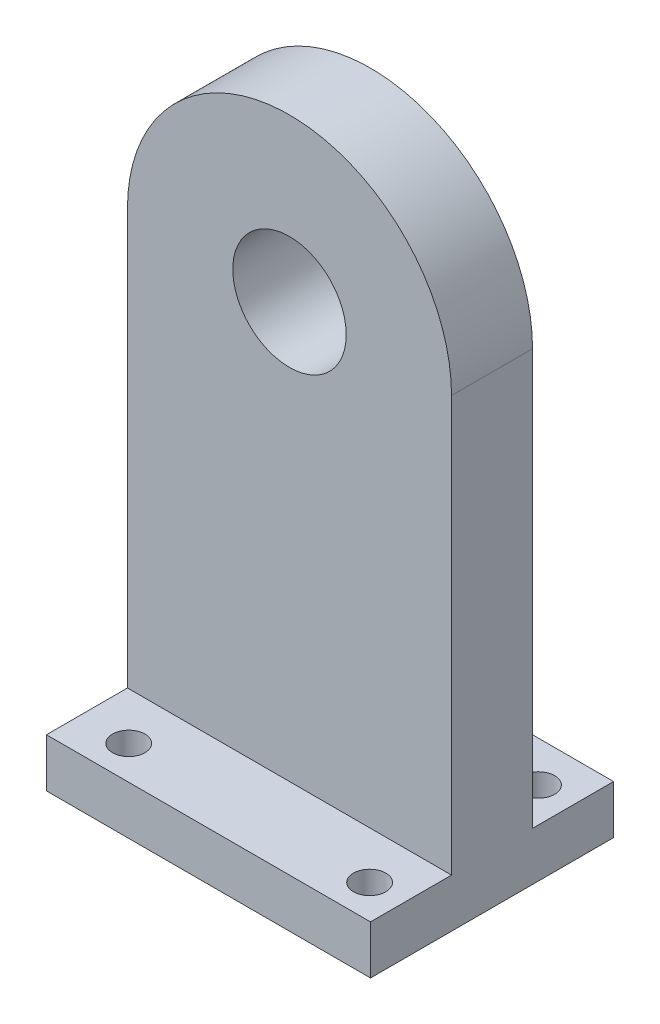
ISO-10303-21;
HEADER;
FILE_DESCRIPTION(('STEP AP214'),'2;1');
FILE_NAME('part.step','',(''),(''),'','','');
FILE_SCHEMA(('AUTOMOTIVE_DESIGN { 1 0 10303 214 1 1 1 1 }'));
ENDSEC;
DATA;
#1=APPLICATION_CONTEXT('core data for automotive mechanical design processes');
#2=APPLICATION_PROTOCOL_DEFINITION('international standard','automotive_design',2000,#1);
#3=PRODUCT_CONTEXT('',#1,'mechanical');
#4=PRODUCT('Part','Part','',(#3));
#5=PRODUCT_RELATED_PRODUCT_CATEGORY('part','',(#4));
#6=PRODUCT_DEFINITION_FORMATION('','',#4);
#7=PRODUCT_DEFINITION_CONTEXT('part definition',#1,'design');
#8=PRODUCT_DEFINITION('design','',#6,#7);
#9=PRODUCT_DEFINITION_SHAPE('','',#8);
#10=(LENGTH_UNIT() NAMED_UNIT(*) SI_UNIT(.MILLI.,.METRE.));
#11=(NAMED_UNIT(*) PLANE_ANGLE_UNIT() SI_UNIT($,.RADIAN.));
#12=(NAMED_UNIT(*) SI_UNIT($,.STERADIAN.) SOLID_ANGLE_UNIT());
#13=UNCERTAINTY_MEASURE_WITH_UNIT(LENGTH_MEASURE(1.E-05),#10,'distance_accuracy_value','');
#14=(GEOMETRIC_REPRESENTATION_CONTEXT(3) GLOBAL_UNCERTAINTY_ASSIGNED_CONTEXT((#13)) GLOBAL_UNIT_ASSIGNED_CONTEXT((#10,
#11,#12)) REPRESENTATION_CONTEXT('',''));
#15=CARTESIAN_POINT('',(0.,0.,0.));
#16=DIRECTION('',(0.,0.,1.));
#17=DIRECTION('',(1.,0.,0.));
#18=AXIS2_PLACEMENT_3D('',#15,#16,#17);
#19=CARTESIAN_POINT('',(10.,-28.63,5.));
#20=DIRECTION('',(0.,1.,0.));
#21=DIRECTION('',(-1.,0.,0.));
#22=AXIS2_PLACEMENT_3D('',#19,#20,#21);
#23=PLANE('',#22);
#24=CARTESIAN_POINT('',(-7.,-28.63,-2.5));
#25=DIRECTION('',(0.,1.,0.));
#26=DIRECTION('',(-1.,0.,0.));
#27=AXIS2_PLACEMENT_3D('',#24,#25,#26);
#28=CIRCLE('',#27,1.);
#29=CARTESIAN_POINT('',(-8.,-28.63,-2.5));
#30=VERTEX_POINT('',#29);
#31=EDGE_CURVE('E129',#30,#30,#28,.T.);
#32=ORIENTED_EDGE('',*,*,#31,.T.);
#33=EDGE_LOOP('',(#32));
#34=FACE_BOUND('',#33,.T.);
#35=CARTESIAN_POINT('',(7.86535574884139,-28.63,-2.5));
#36=DIRECTION('',(0.,1.,0.));
#37=DIRECTION('',(-1.,0.,0.));
#38=AXIS2_PLACEMENT_3D('',#35,#36,#37);
#39=CIRCLE('',#38,1.);
#40=CARTESIAN_POINT('',(6.86535574884139,-28.63,-2.5));
#41=VERTEX_POINT('',#40);
#42=EDGE_CURVE('E133',#41,#41,#39,.T.);
#43=ORIENTED_EDGE('',*,*,#42,.T.);
#44=EDGE_LOOP('',(#43));
#45=FACE_BOUND('',#44,.T.);
#46=CARTESIAN_POINT('',(7.86535574884139,-28.63,7.92068908021796));
#47=DIRECTION('',(0.,1.,0.));
#48=DIRECTION('',(-1.,0.,0.));
#49=AXIS2_PLACEMENT_3D('',#46,#47,#48);
#50=CIRCLE('',#49,1.);
#51=CARTESIAN_POINT('',(6.86535574884139,-28.63,7.92068908021796));
#52=VERTEX_POINT('',#51);
#53=EDGE_CURVE('E249',#52,#52,#50,.T.);
#54=ORIENTED_EDGE('',*,*,#53,.T.);
#55=EDGE_LOOP('',(#54));
#56=FACE_BOUND('',#55,.T.);
#57=CARTESIAN_POINT('',(-7.,-28.63,7.92068908021796));
#58=DIRECTION('',(0.,1.,0.));
#59=DIRECTION('',(-1.,0.,0.));
#60=AXIS2_PLACEMENT_3D('',#57,#58,#59);
#61=CIRCLE('',#60,1.);
#62=CARTESIAN_POINT('',(-8.,-28.63,7.92068908021796));
#63=VERTEX_POINT('',#62);
#64=EDGE_CURVE('E252',#63,#63,#61,.T.);
#65=ORIENTED_EDGE('',*,*,#64,.T.);
#66=EDGE_LOOP('',(#65));
#67=FACE_BOUND('',#66,.T.);
#68=DIRECTION('',(0.,0.,-1.));
#69=VECTOR('',#68,1.);
#70=CARTESIAN_POINT('',(-10.,-28.63,5.));
#71=LINE('',#70,#69);
#72=CARTESIAN_POINT('',(-10.,-28.63,10.));
#73=VERTEX_POINT('',#72);
#74=CARTESIAN_POINT('',(-10.,-28.63,-5.));
#75=VERTEX_POINT('',#74);
#76=EDGE_CURVE('E101',#73,#75,#71,.T.);
#77=ORIENTED_EDGE('',*,*,#76,.T.);
#78=DIRECTION('',(1.,0.,0.));
#79=VECTOR('',#78,1.);
#80=CARTESIAN_POINT('',(-10.,-28.63,-5.));
#81=LINE('',#80,#79);
#82=CARTESIAN_POINT('',(10.,-28.63,-5.));
#83=VERTEX_POINT('',#82);
#84=EDGE_CURVE('E143',#75,#83,#81,.T.);
#85=ORIENTED_EDGE('',*,*,#84,.T.);
#86=DIRECTION('',(0.,0.,-1.));
#87=VECTOR('',#86,1.);
#88=CARTESIAN_POINT('',(10.,-28.63,5.));
#89=LINE('',#88,#87);
#90=CARTESIAN_POINT('',(10.,-28.63,10.));
#91=VERTEX_POINT('',#90);
#92=EDGE_CURVE('E47',#91,#83,#89,.T.);
#93=ORIENTED_EDGE('',*,*,#92,.F.);
#94=DIRECTION('',(1.,0.,0.));
#95=VECTOR('',#94,1.);
#96=CARTESIAN_POINT('',(-10.,-28.63,10.));
#97=LINE('',#96,#95);
#98=EDGE_CURVE('E117',#73,#91,#97,.T.);
#99=ORIENTED_EDGE('',*,*,#98,.F.);
#100=EDGE_LOOP('',(#77,#85,#93,#99));
#101=FACE_BOUND('',#100,.T.);
#102=ADVANCED_FACE('F39',(#34,#45,#56,#67,#101),#23,.F.);
#103=CARTESIAN_POINT('',(10.,0.,5.));
#104=DIRECTION('',(-1.,0.,0.));
#105=DIRECTION('',(0.,-1.,0.));
#106=AXIS2_PLACEMENT_3D('',#103,#104,#105);
#107=PLANE('',#106);
#108=DIRECTION('',(0.,1.,0.));
#109=VECTOR('',#108,1.);
#110=CARTESIAN_POINT('',(10.,0.,5.));
#111=LINE('',#110,#109);
#112=CARTESIAN_POINT('',(10.,-25.63,5.));
#113=VERTEX_POINT('',#112);
#114=CARTESIAN_POINT('',(10.,0.,5.));
#115=VERTEX_POINT('',#114);
#116=EDGE_CURVE('E174',#113,#115,#111,.T.);
#117=ORIENTED_EDGE('',*,*,#116,.F.);
#118=DIRECTION('',(0.,0.,1.));
#119=VECTOR('',#118,1.);
#120=CARTESIAN_POINT('',(10.,-25.63,-5.));
#121=LINE('',#120,#119);
#122=CARTESIAN_POINT('',(10.,-25.63,10.));
#123=VERTEX_POINT('',#122);
#124=EDGE_CURVE('E154',#113,#123,#121,.T.);
#125=ORIENTED_EDGE('',*,*,#124,.T.);
#126=DIRECTION('',(0.,1.,0.));
#127=VECTOR('',#126,1.);
#128=CARTESIAN_POINT('',(10.,-28.63,10.));
#129=LINE('',#128,#127);
#130=EDGE_CURVE('E122',#91,#123,#129,.T.);
#131=ORIENTED_EDGE('',*,*,#130,.F.);
#132=ORIENTED_EDGE('',*,*,#92,.T.);
#133=DIRECTION('',(0.,1.,0.));
#134=VECTOR('',#133,1.);
#135=CARTESIAN_POINT('',(10.,-28.63,-5.));
#136=LINE('',#135,#134);
#137=CARTESIAN_POINT('',(10.,-25.63,-5.));
#138=VERTEX_POINT('',#137);
#139=EDGE_CURVE('E146',#83,#138,#136,.T.);
#140=ORIENTED_EDGE('',*,*,#139,.T.);
#141=CARTESIAN_POINT('',(10.,-25.63,0.));
#142=VERTEX_POINT('',#141);
#143=EDGE_CURVE('E159',#138,#142,#121,.T.);
#144=ORIENTED_EDGE('',*,*,#143,.T.);
#145=DIRECTION('',(0.,1.,0.));
#146=VECTOR('',#145,1.);
#147=CARTESIAN_POINT('',(10.,0.,0.));
#148=LINE('',#147,#146);
#149=CARTESIAN_POINT('',(10.,0.,0.));
#150=VERTEX_POINT('',#149);
#151=EDGE_CURVE('E170',#142,#150,#148,.T.);
#152=ORIENTED_EDGE('',*,*,#151,.T.);
#153=DIRECTION('',(0.,0.,-1.));
#154=VECTOR('',#153,1.);
#155=CARTESIAN_POINT('',(10.,0.,5.));
#156=LINE('',#155,#154);
#157=EDGE_CURVE('E193',#115,#150,#156,.T.);
#158=ORIENTED_EDGE('',*,*,#157,.F.);
#159=EDGE_LOOP('',(#117,#125,#131,#132,#140,#144,#152,#158));
#160=FACE_BOUND('',#159,.T.);
#161=ADVANCED_FACE('F199',(#160),#107,.F.);
#162=CARTESIAN_POINT('',(0.,0.,5.));
#163=DIRECTION('',(0.,0.,-1.));
#164=DIRECTION('',(-1.,0.,0.));
#165=AXIS2_PLACEMENT_3D('',#162,#163,#164);
#166=CYLINDRICAL_SURFACE('',#165,10.);
#167=CARTESIAN_POINT('',(0.,0.,0.));
#168=DIRECTION('',(0.,0.,1.));
#169=DIRECTION('',(-1.,0.,0.));
#170=AXIS2_PLACEMENT_3D('',#167,#168,#169);
#171=CIRCLE('',#170,10.);
#172=CARTESIAN_POINT('',(-10.,0.,0.));
#173=VERTEX_POINT('',#172);
#174=EDGE_CURVE('E185',#150,#173,#171,.T.);
#175=ORIENTED_EDGE('',*,*,#174,.T.);
#176=DIRECTION('',(0.,0.,-1.));
#177=VECTOR('',#176,1.);
#178=CARTESIAN_POINT('',(-10.,0.,5.));
#179=LINE('',#178,#177);
#180=CARTESIAN_POINT('',(-10.,0.,5.));
#181=VERTEX_POINT('',#180);
#182=EDGE_CURVE('E114',#181,#173,#179,.T.);
#183=ORIENTED_EDGE('',*,*,#182,.F.);
#184=CARTESIAN_POINT('',(0.,0.,5.));
#185=DIRECTION('',(0.,0.,1.));
#186=DIRECTION('',(-1.,0.,0.));
#187=AXIS2_PLACEMENT_3D('',#184,#185,#186);
#188=CIRCLE('',#187,10.);
#189=EDGE_CURVE('E177',#115,#181,#188,.T.);
#190=ORIENTED_EDGE('',*,*,#189,.F.);
#191=ORIENTED_EDGE('',*,*,#157,.T.);
#192=EDGE_LOOP('',(#175,#183,#190,#191));
#193=FACE_BOUND('',#192,.T.);
#194=ADVANCED_FACE('F215',(#193),#166,.T.);
#195=CARTESIAN_POINT('',(-10.,-28.63,5.));
#196=DIRECTION('',(1.,0.,0.));
#197=DIRECTION('',(0.,1.,0.));
#198=AXIS2_PLACEMENT_3D('',#195,#196,#197);
#199=PLANE('',#198);
#200=DIRECTION('',(0.,-1.,0.));
#201=VECTOR('',#200,1.);
#202=CARTESIAN_POINT('',(-10.,-28.63,0.));
#203=LINE('',#202,#201);
#204=CARTESIAN_POINT('',(-10.,-25.63,0.));
#205=VERTEX_POINT('',#204);
#206=EDGE_CURVE('E178',#173,#205,#203,.T.);
#207=ORIENTED_EDGE('',*,*,#206,.T.);
#208=DIRECTION('',(0.,0.,1.));
#209=VECTOR('',#208,1.);
#210=CARTESIAN_POINT('',(-10.,-25.63,-5.));
#211=LINE('',#210,#209);
#212=CARTESIAN_POINT('',(-10.,-25.63,-5.));
#213=VERTEX_POINT('',#212);
#214=EDGE_CURVE('E155',#213,#205,#211,.T.);
#215=ORIENTED_EDGE('',*,*,#214,.F.);
#216=DIRECTION('',(0.,-1.,0.));
#217=VECTOR('',#216,1.);
#218=CARTESIAN_POINT('',(-10.,-28.63,-5.));
#219=LINE('',#218,#217);
#220=EDGE_CURVE('E109',#213,#75,#219,.T.);
#221=ORIENTED_EDGE('',*,*,#220,.T.);
#222=ORIENTED_EDGE('',*,*,#76,.F.);
#223=DIRECTION('',(0.,-1.,0.));
#224=VECTOR('',#223,1.);
#225=CARTESIAN_POINT('',(-10.,-28.63,10.));
#226=LINE('',#225,#224);
#227=CARTESIAN_POINT('',(-10.,-25.63,10.));
#228=VERTEX_POINT('',#227);
#229=EDGE_CURVE('E107',#228,#73,#226,.T.);
#230=ORIENTED_EDGE('',*,*,#229,.F.);
#231=CARTESIAN_POINT('',(-10.,-25.63,5.));
#232=VERTEX_POINT('',#231);
#233=EDGE_CURVE('E158',#232,#228,#211,.T.);
#234=ORIENTED_EDGE('',*,*,#233,.F.);
#235=DIRECTION('',(0.,-1.,0.));
#236=VECTOR('',#235,1.);
#237=CARTESIAN_POINT('',(-10.,-28.63,5.));
#238=LINE('',#237,#236);
#239=EDGE_CURVE('E54',#181,#232,#238,.T.);
#240=ORIENTED_EDGE('',*,*,#239,.F.);
#241=ORIENTED_EDGE('',*,*,#182,.T.);
#242=EDGE_LOOP('',(#207,#215,#221,#222,#230,#234,#240,#241));
#243=FACE_BOUND('',#242,.T.);
#244=ADVANCED_FACE('F104',(#243),#199,.F.);
#245=CARTESIAN_POINT('',(0.,0.,5.));
#246=DIRECTION('',(0.,0.,-1.));
#247=DIRECTION('',(-1.,0.,0.));
#248=AXIS2_PLACEMENT_3D('',#245,#246,#247);
#249=PLANE('',#248);
#250=CARTESIAN_POINT('',(0.,0.,5.));
#251=DIRECTION('',(0.,0.,1.));
#252=DIRECTION('',(1.,0.,0.));
#253=AXIS2_PLACEMENT_3D('',#250,#251,#252);
#254=CIRCLE('',#253,3.5);
#255=CARTESIAN_POINT('',(3.5,0.,5.));
#256=VERTEX_POINT('',#255);
#257=EDGE_CURVE('E165',#256,#256,#254,.T.);
#258=ORIENTED_EDGE('',*,*,#257,.F.);
#259=EDGE_LOOP('',(#258));
#260=FACE_BOUND('',#259,.T.);
#261=ORIENTED_EDGE('',*,*,#239,.T.);
#262=DIRECTION('',(1.,0.,0.));
#263=VECTOR('',#262,1.);
#264=CARTESIAN_POINT('',(0.,-25.63,5.));
#265=LINE('',#264,#263);
#266=EDGE_CURVE('E58',#232,#113,#265,.T.);
#267=ORIENTED_EDGE('',*,*,#266,.T.);
#268=ORIENTED_EDGE('',*,*,#116,.T.);
#269=ORIENTED_EDGE('',*,*,#189,.T.);
#270=EDGE_LOOP('',(#261,#267,#268,#269));
#271=FACE_BOUND('',#270,.T.);
#272=ADVANCED_FACE('F302',(#260,#271),#249,.F.);
#273=CARTESIAN_POINT('',(0.,0.,0.));
#274=DIRECTION('',(0.,0.,-1.));
#275=DIRECTION('',(-1.,0.,0.));
#276=AXIS2_PLACEMENT_3D('',#273,#274,#275);
#277=PLANE('',#276);
#278=DIRECTION('',(1.,0.,0.));
#279=VECTOR('',#278,1.);
#280=CARTESIAN_POINT('',(0.,-25.63,0.));
#281=LINE('',#280,#279);
#282=EDGE_CURVE('E11',#205,#142,#281,.T.);
#283=ORIENTED_EDGE('',*,*,#282,.F.);
#284=ORIENTED_EDGE('',*,*,#206,.F.);
#285=ORIENTED_EDGE('',*,*,#174,.F.);
#286=ORIENTED_EDGE('',*,*,#151,.F.);
#287=EDGE_LOOP('',(#283,#284,#285,#286));
#288=FACE_BOUND('',#287,.T.);
#289=CARTESIAN_POINT('',(0.,0.,0.));
#290=DIRECTION('',(0.,0.,1.));
#291=DIRECTION('',(1.,0.,0.));
#292=AXIS2_PLACEMENT_3D('',#289,#290,#291);
#293=CIRCLE('',#292,3.5);
#294=CARTESIAN_POINT('',(3.5,0.,0.));
#295=VERTEX_POINT('',#294);
#296=EDGE_CURVE('E166',#295,#295,#293,.T.);
#297=ORIENTED_EDGE('',*,*,#296,.T.);
#298=EDGE_LOOP('',(#297));
#299=FACE_BOUND('',#298,.T.);
#300=ADVANCED_FACE('F210',(#288,#299),#277,.T.);
#301=CARTESIAN_POINT('',(0.,0.,0.));
#302=DIRECTION('',(0.,0.,1.));
#303=DIRECTION('',(1.,0.,0.));
#304=AXIS2_PLACEMENT_3D('',#301,#302,#303);
#305=CYLINDRICAL_SURFACE('',#304,3.5);
#306=ORIENTED_EDGE('',*,*,#296,.F.);
#307=EDGE_LOOP('',(#306));
#308=FACE_BOUND('',#307,.T.);
#309=ORIENTED_EDGE('',*,*,#257,.T.);
#310=EDGE_LOOP('',(#309));
#311=FACE_BOUND('',#310,.T.);
#312=ADVANCED_FACE('F294',(#308,#311),#305,.F.);
#313=CARTESIAN_POINT('',(0.,0.,-5.));
#314=DIRECTION('',(0.,0.,-1.));
#315=DIRECTION('',(-1.,0.,0.));
#316=AXIS2_PLACEMENT_3D('',#313,#314,#315);
#317=PLANE('',#316);
#318=ORIENTED_EDGE('',*,*,#220,.F.);
#319=DIRECTION('',(-1.,0.,0.));
#320=VECTOR('',#319,1.);
#321=CARTESIAN_POINT('',(-10.,-25.63,-5.));
#322=LINE('',#321,#320);
#323=EDGE_CURVE('E150',#138,#213,#322,.T.);
#324=ORIENTED_EDGE('',*,*,#323,.F.);
#325=ORIENTED_EDGE('',*,*,#139,.F.);
#326=ORIENTED_EDGE('',*,*,#84,.F.);
#327=EDGE_LOOP('',(#318,#324,#325,#326));
#328=FACE_BOUND('',#327,.T.);
#329=ADVANCED_FACE('F202',(#328),#317,.T.);
#330=CARTESIAN_POINT('',(-10.,-25.63,-5.));
#331=DIRECTION('',(0.,1.,0.));
#332=DIRECTION('',(0.,0.,1.));
#333=AXIS2_PLACEMENT_3D('',#330,#331,#332);
#334=PLANE('',#333);
#335=CARTESIAN_POINT('',(-7.,-25.63,-2.5));
#336=DIRECTION('',(0.,1.,0.));
#337=DIRECTION('',(0.,0.,1.));
#338=AXIS2_PLACEMENT_3D('',#335,#336,#337);
#339=CIRCLE('',#338,1.);
#340=CARTESIAN_POINT('',(-7.,-25.63,-1.5));
#341=VERTEX_POINT('',#340);
#342=EDGE_CURVE('E265',#341,#341,#339,.T.);
#343=ORIENTED_EDGE('',*,*,#342,.F.);
#344=EDGE_LOOP('',(#343));
#345=FACE_BOUND('',#344,.T.);
#346=CARTESIAN_POINT('',(7.86535574884139,-25.63,-2.5));
#347=DIRECTION('',(0.,1.,0.));
#348=DIRECTION('',(0.,0.,1.));
#349=AXIS2_PLACEMENT_3D('',#346,#347,#348);
#350=CIRCLE('',#349,1.);
#351=CARTESIAN_POINT('',(7.86535574884139,-25.63,-1.5));
#352=VERTEX_POINT('',#351);
#353=EDGE_CURVE('E269',#352,#352,#350,.T.);
#354=ORIENTED_EDGE('',*,*,#353,.F.);
#355=EDGE_LOOP('',(#354));
#356=FACE_BOUND('',#355,.T.);
#357=ORIENTED_EDGE('',*,*,#214,.T.);
#358=ORIENTED_EDGE('',*,*,#282,.T.);
#359=ORIENTED_EDGE('',*,*,#143,.F.);
#360=ORIENTED_EDGE('',*,*,#323,.T.);
#361=EDGE_LOOP('',(#357,#358,#359,#360));
#362=FACE_BOUND('',#361,.T.);
#363=ADVANCED_FACE('F204',(#345,#356,#362),#334,.T.);
#364=CARTESIAN_POINT('',(7.86535574884139,-25.63,7.92068908021796));
#365=DIRECTION('',(0.,1.,0.));
#366=DIRECTION('',(0.,0.,1.));
#367=AXIS2_PLACEMENT_3D('',#364,#365,#366);
#368=CIRCLE('',#367,1.);
#369=CARTESIAN_POINT('',(7.86535574884139,-25.63,8.92068908021796));
#370=VERTEX_POINT('',#369);
#371=EDGE_CURVE('E261',#370,#370,#368,.T.);
#372=ORIENTED_EDGE('',*,*,#371,.F.);
#373=EDGE_LOOP('',(#372));
#374=FACE_BOUND('',#373,.T.);
#375=CARTESIAN_POINT('',(-7.,-25.63,7.92068908021796));
#376=DIRECTION('',(0.,1.,0.));
#377=DIRECTION('',(0.,0.,1.));
#378=AXIS2_PLACEMENT_3D('',#375,#376,#377);
#379=CIRCLE('',#378,1.);
#380=CARTESIAN_POINT('',(-7.,-25.63,8.92068908021796));
#381=VERTEX_POINT('',#380);
#382=EDGE_CURVE('E255',#381,#381,#379,.T.);
#383=ORIENTED_EDGE('',*,*,#382,.F.);
#384=EDGE_LOOP('',(#383));
#385=FACE_BOUND('',#384,.T.);
#386=ORIENTED_EDGE('',*,*,#266,.F.);
#387=ORIENTED_EDGE('',*,*,#233,.T.);
#388=DIRECTION('',(-1.,0.,0.));
#389=VECTOR('',#388,1.);
#390=CARTESIAN_POINT('',(-10.,-25.63,10.));
#391=LINE('',#390,#389);
#392=EDGE_CURVE('E127',#123,#228,#391,.T.);
#393=ORIENTED_EDGE('',*,*,#392,.F.);
#394=ORIENTED_EDGE('',*,*,#124,.F.);
#395=EDGE_LOOP('',(#386,#387,#393,#394));
#396=FACE_BOUND('',#395,.T.);
#397=ADVANCED_FACE('F221',(#374,#385,#396),#334,.T.);
#398=CARTESIAN_POINT('',(0.,0.,10.));
#399=DIRECTION('',(0.,0.,-1.));
#400=DIRECTION('',(-1.,0.,0.));
#401=AXIS2_PLACEMENT_3D('',#398,#399,#400);
#402=PLANE('',#401);
#403=ORIENTED_EDGE('',*,*,#229,.T.);
#404=ORIENTED_EDGE('',*,*,#98,.T.);
#405=ORIENTED_EDGE('',*,*,#130,.T.);
#406=ORIENTED_EDGE('',*,*,#392,.T.);
#407=EDGE_LOOP('',(#403,#404,#405,#406));
#408=FACE_BOUND('',#407,.T.);
#409=ADVANCED_FACE('F125',(#408),#402,.F.);
#410=CARTESIAN_POINT('',(-7.,-30.63,7.92068908021796));
#411=DIRECTION('',(0.,1.,0.));
#412=DIRECTION('',(0.,0.,1.));
#413=AXIS2_PLACEMENT_3D('',#410,#411,#412);
#414=CYLINDRICAL_SURFACE('',#413,1.);
#415=ORIENTED_EDGE('',*,*,#382,.T.);
#416=EDGE_LOOP('',(#415));
#417=FACE_BOUND('',#416,.T.);
#418=ORIENTED_EDGE('',*,*,#64,.F.);
#419=EDGE_LOOP('',(#418));
#420=FACE_BOUND('',#419,.T.);
#421=ADVANCED_FACE('F229',(#417,#420),#414,.F.);
#422=CARTESIAN_POINT('',(7.86535574884139,-30.63,7.92068908021796));
#423=DIRECTION('',(0.,1.,0.));
#424=DIRECTION('',(0.,0.,1.));
#425=AXIS2_PLACEMENT_3D('',#422,#423,#424);
#426=CYLINDRICAL_SURFACE('',#425,1.);
#427=ORIENTED_EDGE('',*,*,#371,.T.);
#428=EDGE_LOOP('',(#427));
#429=FACE_BOUND('',#428,.T.);
#430=ORIENTED_EDGE('',*,*,#53,.F.);
#431=EDGE_LOOP('',(#430));
#432=FACE_BOUND('',#431,.T.);
#433=ADVANCED_FACE('F276',(#429,#432),#426,.F.);
#434=CARTESIAN_POINT('',(7.86535574884139,-30.63,-2.5));
#435=DIRECTION('',(0.,1.,0.));
#436=DIRECTION('',(0.,0.,1.));
#437=AXIS2_PLACEMENT_3D('',#434,#435,#436);
#438=CYLINDRICAL_SURFACE('',#437,1.);
#439=ORIENTED_EDGE('',*,*,#353,.T.);
#440=EDGE_LOOP('',(#439));
#441=FACE_BOUND('',#440,.T.);
#442=ORIENTED_EDGE('',*,*,#42,.F.);
#443=EDGE_LOOP('',(#442));
#444=FACE_BOUND('',#443,.T.);
#445=ADVANCED_FACE('F279',(#441,#444),#438,.F.);
#446=CARTESIAN_POINT('',(-7.,-30.63,-2.5));
#447=DIRECTION('',(0.,1.,0.));
#448=DIRECTION('',(0.,0.,1.));
#449=AXIS2_PLACEMENT_3D('',#446,#447,#448);
#450=CYLINDRICAL_SURFACE('',#449,1.);
#451=ORIENTED_EDGE('',*,*,#342,.T.);
#452=EDGE_LOOP('',(#451));
#453=FACE_BOUND('',#452,.T.);
#454=ORIENTED_EDGE('',*,*,#31,.F.);
#455=EDGE_LOOP('',(#454));
#456=FACE_BOUND('',#455,.T.);
#457=ADVANCED_FACE('F285',(#453,#456),#450,.F.);
#458=CLOSED_SHELL('',(#102,#161,#194,#244,#272,#300,#312,#329,#363,#397,#409,#421,#433,#445,#457));
#459=MANIFOLD_SOLID_BREP('B2',#458);
#460=ADVANCED_BREP_SHAPE_REPRESENTATION('',(#18,#459),#14);
#461=SHAPE_DEFINITION_REPRESENTATION(#9,#460);
ENDSEC;
END-ISO-10303-21;
